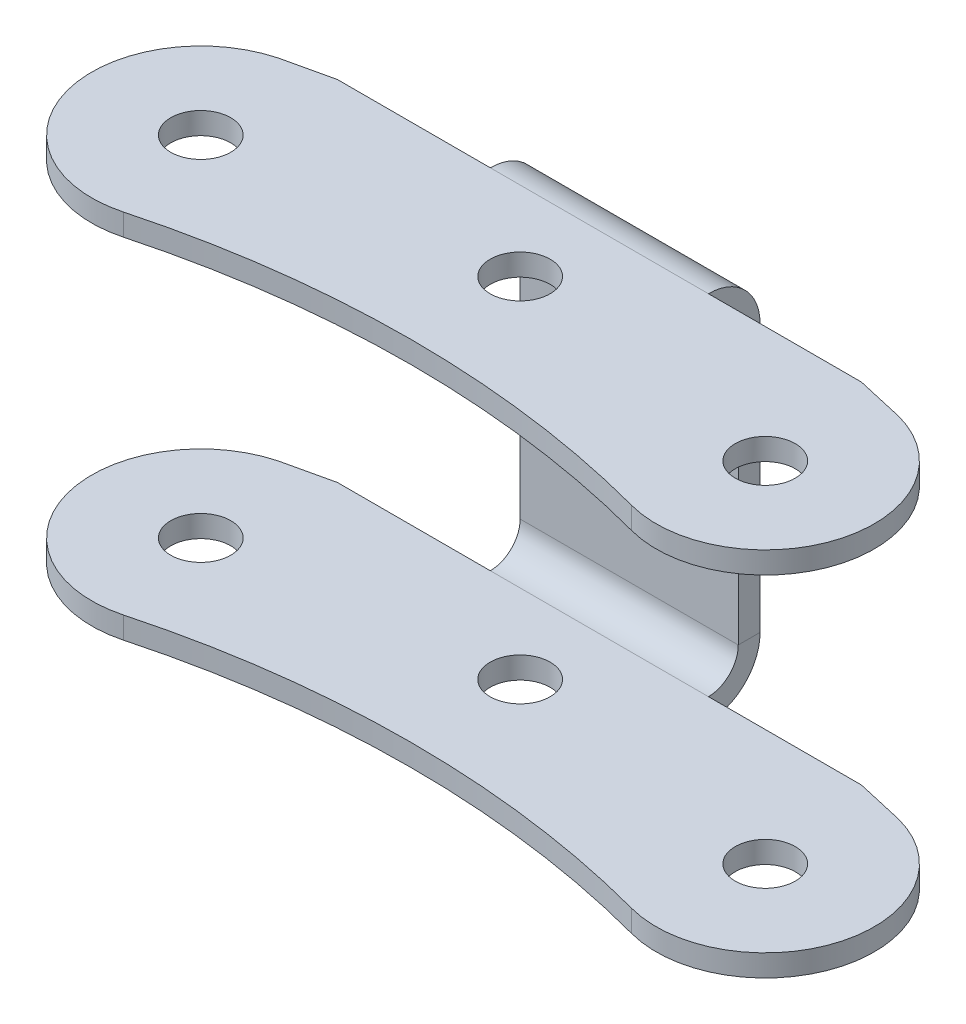
ISO-10303-21;
HEADER;
FILE_DESCRIPTION(('STEP AP214'),'2;1');
FILE_NAME('part.step','',(''),(''),'','','');
FILE_SCHEMA(('AUTOMOTIVE_DESIGN { 1 0 10303 214 1 1 1 1 }'));
ENDSEC;
DATA;
#1=APPLICATION_CONTEXT('core data for automotive mechanical design processes');
#2=APPLICATION_PROTOCOL_DEFINITION('international standard','automotive_design',2000,#1);
#3=PRODUCT_CONTEXT('',#1,'mechanical');
#4=PRODUCT('Part','Part','',(#3));
#5=PRODUCT_RELATED_PRODUCT_CATEGORY('part','',(#4));
#6=PRODUCT_DEFINITION_FORMATION('','',#4);
#7=PRODUCT_DEFINITION_CONTEXT('part definition',#1,'design');
#8=PRODUCT_DEFINITION('design','',#6,#7);
#9=PRODUCT_DEFINITION_SHAPE('','',#8);
#10=(LENGTH_UNIT() NAMED_UNIT(*) SI_UNIT(.MILLI.,.METRE.));
#11=(NAMED_UNIT(*) PLANE_ANGLE_UNIT() SI_UNIT($,.RADIAN.));
#12=(NAMED_UNIT(*) SI_UNIT($,.STERADIAN.) SOLID_ANGLE_UNIT());
#13=UNCERTAINTY_MEASURE_WITH_UNIT(LENGTH_MEASURE(1.E-05),#10,'distance_accuracy_value','');
#14=(GEOMETRIC_REPRESENTATION_CONTEXT(3) GLOBAL_UNCERTAINTY_ASSIGNED_CONTEXT((#13)) GLOBAL_UNIT_ASSIGNED_CONTEXT((#10,
#11,#12)) REPRESENTATION_CONTEXT('',''));
#15=CARTESIAN_POINT('',(0.,0.,0.));
#16=DIRECTION('',(0.,0.,1.));
#17=DIRECTION('',(1.,0.,0.));
#18=AXIS2_PLACEMENT_3D('',#15,#16,#17);
#19=CARTESIAN_POINT('',(0.,0.,-2.));
#20=DIRECTION('',(0.,0.,1.));
#21=DIRECTION('',(1.,0.,0.));
#22=AXIS2_PLACEMENT_3D('',#19,#20,#21);
#23=PLANE('',#22);
#24=DIRECTION('',(1.,0.,0.));
#25=VECTOR('',#24,1.);
#26=CARTESIAN_POINT('',(10.,-12.2634,-2.));
#27=LINE('',#26,#25);
#28=CARTESIAN_POINT('',(10.,-12.2634,-2.));
#29=VERTEX_POINT('',#28);
#30=CARTESIAN_POINT('',(-10.,-12.2634,-2.));
#31=VERTEX_POINT('',#30);
#32=EDGE_CURVE('E270',#29,#31,#27,.F.);
#33=ORIENTED_EDGE('',*,*,#32,.T.);
#34=DIRECTION('',(0.,-1.,0.));
#35=VECTOR('',#34,1.);
#36=CARTESIAN_POINT('',(-10.,17.,-2.));
#37=LINE('',#36,#35);
#38=CARTESIAN_POINT('',(-10.,12.2634,-1.99999999999999));
#39=VERTEX_POINT('',#38);
#40=EDGE_CURVE('E13',#39,#31,#37,.T.);
#41=ORIENTED_EDGE('',*,*,#40,.F.);
#42=DIRECTION('',(-1.,0.,0.));
#43=VECTOR('',#42,1.);
#44=CARTESIAN_POINT('',(-10.,12.2634,-1.99999999999999));
#45=LINE('',#44,#43);
#46=CARTESIAN_POINT('',(10.,12.2634,-2.));
#47=VERTEX_POINT('',#46);
#48=EDGE_CURVE('E351',#39,#47,#45,.F.);
#49=ORIENTED_EDGE('',*,*,#48,.T.);
#50=DIRECTION('',(0.,1.,0.));
#51=VECTOR('',#50,1.);
#52=CARTESIAN_POINT('',(10.,17.,-2.));
#53=LINE('',#52,#51);
#54=EDGE_CURVE('E98',#29,#47,#53,.T.);
#55=ORIENTED_EDGE('',*,*,#54,.F.);
#56=EDGE_LOOP('',(#33,#41,#49,#55));
#57=FACE_BOUND('',#56,.T.);
#58=ADVANCED_FACE('F89',(#57),#23,.F.);
#59=CARTESIAN_POINT('',(0.,0.,0.));
#60=DIRECTION('',(0.,0.,1.));
#61=DIRECTION('',(1.,0.,0.));
#62=AXIS2_PLACEMENT_3D('',#59,#60,#61);
#63=PLANE('',#62);
#64=DIRECTION('',(0.,-1.,0.));
#65=VECTOR('',#64,1.);
#66=CARTESIAN_POINT('',(-10.,17.,0.));
#67=LINE('',#66,#65);
#68=CARTESIAN_POINT('',(-10.,12.2634,0.));
#69=VERTEX_POINT('',#68);
#70=CARTESIAN_POINT('',(-10.,-12.2634,0.));
#71=VERTEX_POINT('',#70);
#72=EDGE_CURVE('E381',#69,#71,#67,.T.);
#73=ORIENTED_EDGE('',*,*,#72,.T.);
#74=DIRECTION('',(1.,0.,0.));
#75=VECTOR('',#74,1.);
#76=CARTESIAN_POINT('',(10.,-12.2634,0.));
#77=LINE('',#76,#75);
#78=CARTESIAN_POINT('',(10.,-12.2634,0.));
#79=VERTEX_POINT('',#78);
#80=EDGE_CURVE('E284',#79,#71,#77,.F.);
#81=ORIENTED_EDGE('',*,*,#80,.F.);
#82=DIRECTION('',(0.,1.,0.));
#83=VECTOR('',#82,1.);
#84=CARTESIAN_POINT('',(10.,17.,0.));
#85=LINE('',#84,#83);
#86=CARTESIAN_POINT('',(10.,12.2634,0.));
#87=VERTEX_POINT('',#86);
#88=EDGE_CURVE('E378',#79,#87,#85,.T.);
#89=ORIENTED_EDGE('',*,*,#88,.T.);
#90=DIRECTION('',(-1.,0.,0.));
#91=VECTOR('',#90,1.);
#92=CARTESIAN_POINT('',(-10.,12.2634,0.));
#93=LINE('',#92,#91);
#94=EDGE_CURVE('E106',#69,#87,#93,.F.);
#95=ORIENTED_EDGE('',*,*,#94,.F.);
#96=EDGE_LOOP('',(#73,#81,#89,#95));
#97=FACE_BOUND('',#96,.T.);
#98=ADVANCED_FACE('F477',(#97),#63,.T.);
#99=CARTESIAN_POINT('',(10.,17.,-2.));
#100=DIRECTION('',(1.,0.,0.));
#101=DIRECTION('',(0.,1.,0.));
#102=AXIS2_PLACEMENT_3D('',#99,#100,#101);
#103=PLANE('',#102);
#104=ORIENTED_EDGE('',*,*,#88,.F.);
#105=DIRECTION('',(0.,0.,-1.));
#106=VECTOR('',#105,1.);
#107=CARTESIAN_POINT('',(10.,-12.2634,0.));
#108=LINE('',#107,#106);
#109=EDGE_CURVE('E275',#79,#29,#108,.T.);
#110=ORIENTED_EDGE('',*,*,#109,.T.);
#111=ORIENTED_EDGE('',*,*,#54,.T.);
#112=DIRECTION('',(0.,0.,-1.));
#113=VECTOR('',#112,1.);
#114=CARTESIAN_POINT('',(10.,12.2634,0.));
#115=LINE('',#114,#113);
#116=EDGE_CURVE('E370',#87,#47,#115,.T.);
#117=ORIENTED_EDGE('',*,*,#116,.F.);
#118=EDGE_LOOP('',(#104,#110,#111,#117));
#119=FACE_BOUND('',#118,.T.);
#120=ADVANCED_FACE('F91',(#119),#103,.T.);
#121=CARTESIAN_POINT('',(-10.,17.,-2.));
#122=DIRECTION('',(-1.,0.,0.));
#123=DIRECTION('',(0.,-1.,0.));
#124=AXIS2_PLACEMENT_3D('',#121,#122,#123);
#125=PLANE('',#124);
#126=DIRECTION('',(0.,0.,-1.));
#127=VECTOR('',#126,1.);
#128=CARTESIAN_POINT('',(-10.,-12.2634,0.));
#129=LINE('',#128,#127);
#130=EDGE_CURVE('E292',#71,#31,#129,.T.);
#131=ORIENTED_EDGE('',*,*,#130,.F.);
#132=ORIENTED_EDGE('',*,*,#72,.F.);
#133=DIRECTION('',(0.,0.,-1.));
#134=VECTOR('',#133,1.);
#135=CARTESIAN_POINT('',(-10.,12.2634,0.));
#136=LINE('',#135,#134);
#137=EDGE_CURVE('E356',#69,#39,#136,.T.);
#138=ORIENTED_EDGE('',*,*,#137,.T.);
#139=ORIENTED_EDGE('',*,*,#40,.T.);
#140=EDGE_LOOP('',(#131,#132,#138,#139));
#141=FACE_BOUND('',#140,.T.);
#142=ADVANCED_FACE('F501',(#141),#125,.T.);
#143=CARTESIAN_POINT('',(10.,12.2634,2.73660000000001));
#144=DIRECTION('',(1.,0.,0.));
#145=DIRECTION('',(0.,0.,-1.));
#146=AXIS2_PLACEMENT_3D('',#143,#144,#145);
#147=PLANE('',#146);
#148=DIRECTION('',(0.,1.,0.));
#149=VECTOR('',#148,1.);
#150=CARTESIAN_POINT('',(10.,15.,2.7366));
#151=LINE('',#150,#149);
#152=CARTESIAN_POINT('',(10.,15.,2.7366));
#153=VERTEX_POINT('',#152);
#154=CARTESIAN_POINT('',(10.,17.,2.73659999999999));
#155=VERTEX_POINT('',#154);
#156=EDGE_CURVE('E373',#153,#155,#151,.T.);
#157=ORIENTED_EDGE('',*,*,#156,.F.);
#158=CARTESIAN_POINT('',(10.,12.2634,2.73660000000001));
#159=DIRECTION('',(-1.,0.,0.));
#160=DIRECTION('',(0.,0.,1.));
#161=AXIS2_PLACEMENT_3D('',#158,#159,#160);
#162=CIRCLE('',#161,2.7366);
#163=EDGE_CURVE('E360',#87,#153,#162,.F.);
#164=ORIENTED_EDGE('',*,*,#163,.F.);
#165=ORIENTED_EDGE('',*,*,#116,.T.);
#166=CARTESIAN_POINT('',(10.,12.2634,2.73660000000001));
#167=DIRECTION('',(-1.,0.,0.));
#168=DIRECTION('',(0.,0.,1.));
#169=AXIS2_PLACEMENT_3D('',#166,#167,#168);
#170=CIRCLE('',#169,4.7366);
#171=EDGE_CURVE('E353',#47,#155,#170,.F.);
#172=ORIENTED_EDGE('',*,*,#171,.T.);
#173=EDGE_LOOP('',(#157,#164,#165,#172));
#174=FACE_BOUND('',#173,.T.);
#175=ADVANCED_FACE('F503',(#174),#147,.T.);
#176=CARTESIAN_POINT('',(-10.,12.2634,2.73660000000001));
#177=DIRECTION('',(1.,0.,0.));
#178=DIRECTION('',(0.,0.,-1.));
#179=AXIS2_PLACEMENT_3D('',#176,#177,#178);
#180=PLANE('',#179);
#181=CARTESIAN_POINT('',(-10.,12.2634,2.73660000000001));
#182=DIRECTION('',(-1.,0.,0.));
#183=DIRECTION('',(0.,0.,1.));
#184=AXIS2_PLACEMENT_3D('',#181,#182,#183);
#185=CIRCLE('',#184,2.7366);
#186=CARTESIAN_POINT('',(-10.,15.,2.7366));
#187=VERTEX_POINT('',#186);
#188=EDGE_CURVE('E366',#187,#69,#185,.T.);
#189=ORIENTED_EDGE('',*,*,#188,.F.);
#190=DIRECTION('',(0.,1.,0.));
#191=VECTOR('',#190,1.);
#192=CARTESIAN_POINT('',(-10.,15.,2.7366));
#193=LINE('',#192,#191);
#194=CARTESIAN_POINT('',(-10.,17.,2.73659999999999));
#195=VERTEX_POINT('',#194);
#196=EDGE_CURVE('E376',#187,#195,#193,.T.);
#197=ORIENTED_EDGE('',*,*,#196,.T.);
#198=CARTESIAN_POINT('',(-10.,12.2634,2.73660000000001));
#199=DIRECTION('',(-1.,0.,0.));
#200=DIRECTION('',(0.,0.,1.));
#201=AXIS2_PLACEMENT_3D('',#198,#199,#200);
#202=CIRCLE('',#201,4.7366);
#203=EDGE_CURVE('E354',#195,#39,#202,.T.);
#204=ORIENTED_EDGE('',*,*,#203,.T.);
#205=ORIENTED_EDGE('',*,*,#137,.F.);
#206=EDGE_LOOP('',(#189,#197,#204,#205));
#207=FACE_BOUND('',#206,.T.);
#208=ADVANCED_FACE('F499',(#207),#180,.F.);
#209=CARTESIAN_POINT('',(-10.,12.2634,2.73660000000001));
#210=DIRECTION('',(-1.,0.,0.));
#211=DIRECTION('',(0.,1.,0.));
#212=AXIS2_PLACEMENT_3D('',#209,#210,#211);
#213=CYLINDRICAL_SURFACE('',#212,4.7366);
#214=ORIENTED_EDGE('',*,*,#48,.F.);
#215=ORIENTED_EDGE('',*,*,#203,.F.);
#216=DIRECTION('',(-1.,0.,0.));
#217=VECTOR('',#216,1.);
#218=CARTESIAN_POINT('',(-10.,17.,2.73659999999999));
#219=LINE('',#218,#217);
#220=EDGE_CURVE('E357',#155,#195,#219,.T.);
#221=ORIENTED_EDGE('',*,*,#220,.F.);
#222=ORIENTED_EDGE('',*,*,#171,.F.);
#223=EDGE_LOOP('',(#214,#215,#221,#222));
#224=FACE_BOUND('',#223,.T.);
#225=ADVANCED_FACE('F517',(#224),#213,.T.);
#226=CARTESIAN_POINT('',(-10.,12.2634,2.73660000000001));
#227=DIRECTION('',(-1.,0.,0.));
#228=DIRECTION('',(0.,1.,0.));
#229=AXIS2_PLACEMENT_3D('',#226,#227,#228);
#230=CYLINDRICAL_SURFACE('',#229,2.7366);
#231=ORIENTED_EDGE('',*,*,#94,.T.);
#232=ORIENTED_EDGE('',*,*,#163,.T.);
#233=DIRECTION('',(-1.,0.,0.));
#234=VECTOR('',#233,1.);
#235=CARTESIAN_POINT('',(-10.,15.,2.7366));
#236=LINE('',#235,#234);
#237=EDGE_CURVE('E303',#153,#187,#236,.T.);
#238=ORIENTED_EDGE('',*,*,#237,.T.);
#239=ORIENTED_EDGE('',*,*,#188,.T.);
#240=EDGE_LOOP('',(#231,#232,#238,#239));
#241=FACE_BOUND('',#240,.T.);
#242=ADVANCED_FACE('F541',(#241),#230,.F.);
#243=CARTESIAN_POINT('',(24.0251196840593,15.,2.7366));
#244=DIRECTION('',(0.,0.,-1.));
#245=DIRECTION('',(0.,1.,0.));
#246=AXIS2_PLACEMENT_3D('',#243,#244,#245);
#247=PLANE('',#246);
#248=ORIENTED_EDGE('',*,*,#196,.F.);
#249=DIRECTION('',(-1.,0.,0.));
#250=VECTOR('',#249,1.);
#251=CARTESIAN_POINT('',(24.0251196840593,15.,2.7366));
#252=LINE('',#251,#250);
#253=CARTESIAN_POINT('',(-24.0251196840594,15.,2.7366));
#254=VERTEX_POINT('',#253);
#255=EDGE_CURVE('E348',#187,#254,#252,.T.);
#256=ORIENTED_EDGE('',*,*,#255,.T.);
#257=DIRECTION('',(0.,1.,0.));
#258=VECTOR('',#257,1.);
#259=CARTESIAN_POINT('',(-24.0251196840594,15.,2.7366));
#260=LINE('',#259,#258);
#261=CARTESIAN_POINT('',(-24.0251196840593,17.,2.73659999999998));
#262=VERTEX_POINT('',#261);
#263=EDGE_CURVE('E343',#254,#262,#260,.T.);
#264=ORIENTED_EDGE('',*,*,#263,.T.);
#265=DIRECTION('',(-1.,0.,0.));
#266=VECTOR('',#265,1.);
#267=CARTESIAN_POINT('',(24.0251196840593,17.,2.7366));
#268=LINE('',#267,#266);
#269=EDGE_CURVE('E339',#262,#195,#268,.F.);
#270=ORIENTED_EDGE('',*,*,#269,.T.);
#271=EDGE_LOOP('',(#248,#256,#264,#270));
#272=FACE_BOUND('',#271,.T.);
#273=ADVANCED_FACE('F545',(#272),#247,.T.);
#274=CARTESIAN_POINT('',(12.,17.,0.));
#275=DIRECTION('',(0.221900074287889,0.,-0.975069411391327));
#276=DIRECTION('',(-0.975069411391327,0.,-0.221900074287889));
#277=AXIS2_PLACEMENT_3D('',#274,#275,#276);
#278=PLANE('',#277);
#279=DIRECTION('',(0.975069411391327,0.,0.221900074287889));
#280=VECTOR('',#279,1.);
#281=CARTESIAN_POINT('',(28.099300232636,15.,3.66377601006624));
#282=LINE('',#281,#280);
#283=CARTESIAN_POINT('',(24.0251196840593,15.,2.7366));
#284=VERTEX_POINT('',#283);
#285=CARTESIAN_POINT('',(28.4700949612768,15.,3.74815910820237));
#286=VERTEX_POINT('',#285);
#287=EDGE_CURVE('E337',#284,#286,#282,.T.);
#288=ORIENTED_EDGE('',*,*,#287,.F.);
#289=DIRECTION('',(0.,1.,0.));
#290=VECTOR('',#289,1.);
#291=CARTESIAN_POINT('',(24.0251196840593,17.,2.7366));
#292=LINE('',#291,#290);
#293=CARTESIAN_POINT('',(24.0251196840593,17.,2.7366));
#294=VERTEX_POINT('',#293);
#295=EDGE_CURVE('E299',#284,#294,#292,.T.);
#296=ORIENTED_EDGE('',*,*,#295,.T.);
#297=DIRECTION('',(-0.975069411391327,0.,-0.221900074287889));
#298=VECTOR('',#297,1.);
#299=CARTESIAN_POINT('',(12.,17.,0.));
#300=LINE('',#299,#298);
#301=CARTESIAN_POINT('',(28.4700949612768,17.,3.74815910820237));
#302=VERTEX_POINT('',#301);
#303=EDGE_CURVE('E323',#294,#302,#300,.F.);
#304=ORIENTED_EDGE('',*,*,#303,.T.);
#305=DIRECTION('',(0.,-1.,0.));
#306=VECTOR('',#305,1.);
#307=CARTESIAN_POINT('',(28.4700949612774,17.,3.74815910820252));
#308=LINE('',#307,#306);
#309=EDGE_CURVE('E308',#302,#286,#308,.T.);
#310=ORIENTED_EDGE('',*,*,#309,.T.);
#311=EDGE_LOOP('',(#288,#296,#304,#310));
#312=FACE_BOUND('',#311,.T.);
#313=ADVANCED_FACE('F530',(#312),#278,.T.);
#314=CARTESIAN_POINT('',(-12.,17.,0.));
#315=DIRECTION('',(-0.221900074287887,0.,-0.975069411391328));
#316=DIRECTION('',(-0.975069411391328,0.,0.221900074287887));
#317=AXIS2_PLACEMENT_3D('',#314,#315,#316);
#318=PLANE('',#317);
#319=DIRECTION('',(-0.975069411391328,0.,0.221900074287887));
#320=VECTOR('',#319,1.);
#321=CARTESIAN_POINT('',(-12.,17.,0.));
#322=LINE('',#321,#320);
#323=CARTESIAN_POINT('',(-28.470094961276,17.,3.74815910820212));
#324=VERTEX_POINT('',#323);
#325=EDGE_CURVE('E311',#324,#262,#322,.F.);
#326=ORIENTED_EDGE('',*,*,#325,.T.);
#327=ORIENTED_EDGE('',*,*,#263,.F.);
#328=DIRECTION('',(0.975069411391328,0.,-0.221900074287887));
#329=VECTOR('',#328,1.);
#330=CARTESIAN_POINT('',(21.1156773129848,15.,-7.53625451685498));
#331=LINE('',#330,#329);
#332=CARTESIAN_POINT('',(-28.4700949612759,15.,3.74815910820212));
#333=VERTEX_POINT('',#332);
#334=EDGE_CURVE('E325',#333,#254,#331,.T.);
#335=ORIENTED_EDGE('',*,*,#334,.F.);
#336=DIRECTION('',(0.,-1.,0.));
#337=VECTOR('',#336,1.);
#338=CARTESIAN_POINT('',(-28.4700949612766,17.,3.74815910820226));
#339=LINE('',#338,#337);
#340=EDGE_CURVE('E301',#324,#333,#339,.T.);
#341=ORIENTED_EDGE('',*,*,#340,.F.);
#342=EDGE_LOOP('',(#326,#327,#335,#341));
#343=FACE_BOUND('',#342,.T.);
#344=ADVANCED_FACE('F550',(#343),#318,.T.);
#345=CARTESIAN_POINT('',(25.8819045102522,17.,13.4074173710932));
#346=DIRECTION('',(0.,-1.,0.));
#347=DIRECTION('',(0.,0.,-1.));
#348=AXIS2_PLACEMENT_3D('',#345,#346,#347);
#349=PLANE('',#348);
#350=CARTESIAN_POINT('',(0.,17.,9.99999999999994));
#351=DIRECTION('',(0.,1.,0.));
#352=DIRECTION('',(0.,0.,1.));
#353=AXIS2_PLACEMENT_3D('',#350,#351,#352);
#354=CIRCLE('',#353,2.75);
#355=CARTESIAN_POINT('',(0.,17.,12.7499999999999));
#356=VERTEX_POINT('',#355);
#357=EDGE_CURVE('E397',#356,#356,#354,.T.);
#358=ORIENTED_EDGE('',*,*,#357,.F.);
#359=EDGE_LOOP('',(#358));
#360=FACE_BOUND('',#359,.T.);
#361=CARTESIAN_POINT('',(-25.8819045102514,17.,13.407417371093));
#362=DIRECTION('',(0.,1.,0.));
#363=DIRECTION('',(0.,0.,1.));
#364=AXIS2_PLACEMENT_3D('',#361,#362,#363);
#365=CIRCLE('',#364,2.75);
#366=CARTESIAN_POINT('',(-25.8819045102514,17.0000000000001,16.157417371093));
#367=VERTEX_POINT('',#366);
#368=EDGE_CURVE('E407',#367,#367,#365,.T.);
#369=ORIENTED_EDGE('',*,*,#368,.F.);
#370=EDGE_LOOP('',(#369));
#371=FACE_BOUND('',#370,.T.);
#372=CARTESIAN_POINT('',(25.8819045102514,17.,13.4074173710929));
#373=DIRECTION('',(0.,1.,0.));
#374=DIRECTION('',(0.,0.,1.));
#375=AXIS2_PLACEMENT_3D('',#372,#373,#374);
#376=CIRCLE('',#375,2.75);
#377=CARTESIAN_POINT('',(25.8819045102514,17.0000000000001,16.1574173710929));
#378=VERTEX_POINT('',#377);
#379=EDGE_CURVE('E413',#378,#378,#376,.T.);
#380=ORIENTED_EDGE('',*,*,#379,.F.);
#381=EDGE_LOOP('',(#380));
#382=FACE_BOUND('',#381,.T.);
#383=ORIENTED_EDGE('',*,*,#269,.F.);
#384=ORIENTED_EDGE('',*,*,#325,.F.);
#385=CARTESIAN_POINT('',(-25.8819045102514,17.,13.407417371093));
#386=DIRECTION('',(0.,-1.,0.));
#387=DIRECTION('',(0.,0.,-1.));
#388=AXIS2_PLACEMENT_3D('',#385,#386,#387);
#389=CIRCLE('',#388,9.99999999999999);
#390=CARTESIAN_POINT('',(-23.2937140592263,17.0000000000001,23.0666756339837));
#391=VERTEX_POINT('',#390);
#392=EDGE_CURVE('E314',#391,#324,#389,.T.);
#393=ORIENTED_EDGE('',*,*,#392,.F.);
#394=CARTESIAN_POINT('',(0.,17.0000000000004,110.));
#395=DIRECTION('',(0.,-1.,0.));
#396=DIRECTION('',(0.,0.,-1.));
#397=AXIS2_PLACEMENT_3D('',#394,#395,#396);
#398=CIRCLE('',#397,90.0000000000001);
#399=CARTESIAN_POINT('',(23.293714059227,17.0000000000001,23.0666756339838));
#400=VERTEX_POINT('',#399);
#401=EDGE_CURVE('E317',#400,#391,#398,.F.);
#402=ORIENTED_EDGE('',*,*,#401,.F.);
#403=CARTESIAN_POINT('',(25.8819045102522,17.,13.4074173710932));
#404=DIRECTION('',(0.,-1.,0.));
#405=DIRECTION('',(0.,0.,-1.));
#406=AXIS2_PLACEMENT_3D('',#403,#404,#405);
#407=CIRCLE('',#406,9.99999999999999);
#408=EDGE_CURVE('E320',#302,#400,#407,.T.);
#409=ORIENTED_EDGE('',*,*,#408,.F.);
#410=ORIENTED_EDGE('',*,*,#303,.F.);
#411=EDGE_CURVE('E342',#155,#294,#268,.F.);
#412=ORIENTED_EDGE('',*,*,#411,.F.);
#413=ORIENTED_EDGE('',*,*,#220,.T.);
#414=EDGE_LOOP('',(#383,#384,#393,#402,#409,#410,#412,#413));
#415=FACE_BOUND('',#414,.T.);
#416=ADVANCED_FACE('F524',(#360,#371,#382,#415),#349,.F.);
#417=CARTESIAN_POINT('',(25.8819045102522,15.,13.4074173710932));
#418=DIRECTION('',(0.,-1.,0.));
#419=DIRECTION('',(0.,0.,-1.));
#420=AXIS2_PLACEMENT_3D('',#417,#418,#419);
#421=PLANE('',#420);
#422=CARTESIAN_POINT('',(0.,15.,9.99999999999994));
#423=DIRECTION('',(0.,-1.,0.));
#424=DIRECTION('',(0.,0.,-1.));
#425=AXIS2_PLACEMENT_3D('',#422,#423,#424);
#426=CIRCLE('',#425,2.75);
#427=CARTESIAN_POINT('',(0.,15.,7.24999999999994));
#428=VERTEX_POINT('',#427);
#429=EDGE_CURVE('E410',#428,#428,#426,.T.);
#430=ORIENTED_EDGE('',*,*,#429,.F.);
#431=EDGE_LOOP('',(#430));
#432=FACE_BOUND('',#431,.T.);
#433=CARTESIAN_POINT('',(-25.8819045102514,15.,13.407417371093));
#434=DIRECTION('',(0.,-1.,0.));
#435=DIRECTION('',(0.,0.,-1.));
#436=AXIS2_PLACEMENT_3D('',#433,#434,#435);
#437=CIRCLE('',#436,2.75);
#438=CARTESIAN_POINT('',(-25.8819045102514,15.,10.657417371093));
#439=VERTEX_POINT('',#438);
#440=EDGE_CURVE('E390',#439,#439,#437,.T.);
#441=ORIENTED_EDGE('',*,*,#440,.F.);
#442=EDGE_LOOP('',(#441));
#443=FACE_BOUND('',#442,.T.);
#444=CARTESIAN_POINT('',(25.8819045102514,15.,13.4074173710929));
#445=DIRECTION('',(0.,-1.,0.));
#446=DIRECTION('',(0.,0.,-1.));
#447=AXIS2_PLACEMENT_3D('',#444,#445,#446);
#448=CIRCLE('',#447,2.75);
#449=CARTESIAN_POINT('',(25.8819045102514,15.,10.6574173710929));
#450=VERTEX_POINT('',#449);
#451=EDGE_CURVE('E241',#450,#450,#448,.T.);
#452=ORIENTED_EDGE('',*,*,#451,.F.);
#453=EDGE_LOOP('',(#452));
#454=FACE_BOUND('',#453,.T.);
#455=ORIENTED_EDGE('',*,*,#334,.T.);
#456=ORIENTED_EDGE('',*,*,#255,.F.);
#457=ORIENTED_EDGE('',*,*,#237,.F.);
#458=EDGE_CURVE('E345',#284,#153,#252,.T.);
#459=ORIENTED_EDGE('',*,*,#458,.F.);
#460=ORIENTED_EDGE('',*,*,#287,.T.);
#461=CARTESIAN_POINT('',(25.8819045102522,15.,13.4074173710932));
#462=DIRECTION('',(0.,-1.,0.));
#463=DIRECTION('',(0.,0.,-1.));
#464=AXIS2_PLACEMENT_3D('',#461,#462,#463);
#465=CIRCLE('',#464,9.99999999999999);
#466=CARTESIAN_POINT('',(23.293714059227,15.0000000000001,23.0666756339838));
#467=VERTEX_POINT('',#466);
#468=EDGE_CURVE('E334',#286,#467,#465,.T.);
#469=ORIENTED_EDGE('',*,*,#468,.T.);
#470=CARTESIAN_POINT('',(0.,15.0000000000004,110.));
#471=DIRECTION('',(0.,-1.,0.));
#472=DIRECTION('',(0.,0.,-1.));
#473=AXIS2_PLACEMENT_3D('',#470,#471,#472);
#474=CIRCLE('',#473,90.0000000000001);
#475=CARTESIAN_POINT('',(-23.2937140592263,15.0000000000001,23.0666756339837));
#476=VERTEX_POINT('',#475);
#477=EDGE_CURVE('E331',#467,#476,#474,.F.);
#478=ORIENTED_EDGE('',*,*,#477,.T.);
#479=CARTESIAN_POINT('',(-25.8819045102514,15.,13.407417371093));
#480=DIRECTION('',(0.,-1.,0.));
#481=DIRECTION('',(0.,0.,-1.));
#482=AXIS2_PLACEMENT_3D('',#479,#480,#481);
#483=CIRCLE('',#482,9.99999999999999);
#484=EDGE_CURVE('E328',#476,#333,#483,.T.);
#485=ORIENTED_EDGE('',*,*,#484,.T.);
#486=EDGE_LOOP('',(#455,#456,#457,#459,#460,#469,#478,#485));
#487=FACE_BOUND('',#486,.T.);
#488=ADVANCED_FACE('F536',(#432,#443,#454,#487),#421,.T.);
#489=CARTESIAN_POINT('',(-25.8819045102514,17.,13.407417371093));
#490=DIRECTION('',(0.,-1.,0.));
#491=DIRECTION('',(0.,0.,-1.));
#492=AXIS2_PLACEMENT_3D('',#489,#490,#491);
#493=CYLINDRICAL_SURFACE('',#492,9.99999999999999);
#494=ORIENTED_EDGE('',*,*,#484,.F.);
#495=DIRECTION('',(0.,-1.,0.));
#496=VECTOR('',#495,1.);
#497=CARTESIAN_POINT('',(-23.2937140592263,17.0000000000001,23.0666756339837));
#498=LINE('',#497,#496);
#499=EDGE_CURVE('E304',#391,#476,#498,.T.);
#500=ORIENTED_EDGE('',*,*,#499,.F.);
#501=ORIENTED_EDGE('',*,*,#392,.T.);
#502=ORIENTED_EDGE('',*,*,#340,.T.);
#503=EDGE_LOOP('',(#494,#500,#501,#502));
#504=FACE_BOUND('',#503,.T.);
#505=ADVANCED_FACE('F554',(#504),#493,.T.);
#506=CARTESIAN_POINT('',(0.,17.0000000000004,110.));
#507=DIRECTION('',(0.,-1.,0.));
#508=DIRECTION('',(0.,0.,-1.));
#509=AXIS2_PLACEMENT_3D('',#506,#507,#508);
#510=CYLINDRICAL_SURFACE('',#509,90.0000000000001);
#511=ORIENTED_EDGE('',*,*,#477,.F.);
#512=DIRECTION('',(0.,-1.,0.));
#513=VECTOR('',#512,1.);
#514=CARTESIAN_POINT('',(23.293714059227,17.0000000000001,23.0666756339838));
#515=LINE('',#514,#513);
#516=EDGE_CURVE('E306',#400,#467,#515,.T.);
#517=ORIENTED_EDGE('',*,*,#516,.F.);
#518=ORIENTED_EDGE('',*,*,#401,.T.);
#519=ORIENTED_EDGE('',*,*,#499,.T.);
#520=EDGE_LOOP('',(#511,#517,#518,#519));
#521=FACE_BOUND('',#520,.T.);
#522=ADVANCED_FACE('F556',(#521),#510,.F.);
#523=CARTESIAN_POINT('',(25.8819045102522,17.,13.4074173710932));
#524=DIRECTION('',(0.,-1.,0.));
#525=DIRECTION('',(0.,0.,-1.));
#526=AXIS2_PLACEMENT_3D('',#523,#524,#525);
#527=CYLINDRICAL_SURFACE('',#526,9.99999999999999);
#528=ORIENTED_EDGE('',*,*,#468,.F.);
#529=ORIENTED_EDGE('',*,*,#309,.F.);
#530=ORIENTED_EDGE('',*,*,#408,.T.);
#531=ORIENTED_EDGE('',*,*,#516,.T.);
#532=EDGE_LOOP('',(#528,#529,#530,#531));
#533=FACE_BOUND('',#532,.T.);
#534=ADVANCED_FACE('F533',(#533),#527,.T.);
#535=ORIENTED_EDGE('',*,*,#458,.T.);
#536=ORIENTED_EDGE('',*,*,#156,.T.);
#537=ORIENTED_EDGE('',*,*,#411,.T.);
#538=ORIENTED_EDGE('',*,*,#295,.F.);
#539=EDGE_LOOP('',(#535,#536,#537,#538));
#540=FACE_BOUND('',#539,.T.);
#541=ADVANCED_FACE('F488',(#540),#247,.T.);
#542=CARTESIAN_POINT('',(-10.,-12.2634,2.73659999999999));
#543=DIRECTION('',(-1.,0.,0.));
#544=DIRECTION('',(0.,0.,1.));
#545=AXIS2_PLACEMENT_3D('',#542,#543,#544);
#546=PLANE('',#545);
#547=DIRECTION('',(0.,-1.,0.));
#548=VECTOR('',#547,1.);
#549=CARTESIAN_POINT('',(-10.,-15.,2.73659999999998));
#550=LINE('',#549,#548);
#551=CARTESIAN_POINT('',(-10.,-15.,2.73659999999998));
#552=VERTEX_POINT('',#551);
#553=CARTESIAN_POINT('',(-10.,-17.,2.73659999999998));
#554=VERTEX_POINT('',#553);
#555=EDGE_CURVE('E295',#552,#554,#550,.T.);
#556=ORIENTED_EDGE('',*,*,#555,.F.);
#557=CARTESIAN_POINT('',(-10.,-12.2634,2.73659999999999));
#558=DIRECTION('',(1.,0.,0.));
#559=DIRECTION('',(0.,0.,-1.));
#560=AXIS2_PLACEMENT_3D('',#557,#558,#559);
#561=CIRCLE('',#560,2.7366);
#562=EDGE_CURVE('E279',#71,#552,#561,.F.);
#563=ORIENTED_EDGE('',*,*,#562,.F.);
#564=ORIENTED_EDGE('',*,*,#130,.T.);
#565=CARTESIAN_POINT('',(-10.,-12.2634,2.73659999999999));
#566=DIRECTION('',(1.,0.,0.));
#567=DIRECTION('',(0.,0.,-1.));
#568=AXIS2_PLACEMENT_3D('',#565,#566,#567);
#569=CIRCLE('',#568,4.7366);
#570=EDGE_CURVE('E272',#31,#554,#569,.F.);
#571=ORIENTED_EDGE('',*,*,#570,.T.);
#572=EDGE_LOOP('',(#556,#563,#564,#571));
#573=FACE_BOUND('',#572,.T.);
#574=ADVANCED_FACE('F472',(#573),#546,.T.);
#575=CARTESIAN_POINT('',(10.,-12.2634,2.7366));
#576=DIRECTION('',(-1.,0.,0.));
#577=DIRECTION('',(0.,0.,1.));
#578=AXIS2_PLACEMENT_3D('',#575,#576,#577);
#579=PLANE('',#578);
#580=CARTESIAN_POINT('',(10.,-12.2634,2.7366));
#581=DIRECTION('',(1.,0.,0.));
#582=DIRECTION('',(0.,0.,-1.));
#583=AXIS2_PLACEMENT_3D('',#580,#581,#582);
#584=CIRCLE('',#583,2.7366);
#585=CARTESIAN_POINT('',(10.,-15.,2.73659999999999));
#586=VERTEX_POINT('',#585);
#587=EDGE_CURVE('E287',#586,#79,#584,.T.);
#588=ORIENTED_EDGE('',*,*,#587,.F.);
#589=DIRECTION('',(0.,-1.,0.));
#590=VECTOR('',#589,1.);
#591=CARTESIAN_POINT('',(10.,-15.,2.73659999999999));
#592=LINE('',#591,#590);
#593=CARTESIAN_POINT('',(10.,-17.,2.73659999999998));
#594=VERTEX_POINT('',#593);
#595=EDGE_CURVE('E297',#586,#594,#592,.T.);
#596=ORIENTED_EDGE('',*,*,#595,.T.);
#597=CARTESIAN_POINT('',(10.,-12.2634,2.7366));
#598=DIRECTION('',(1.,0.,0.));
#599=DIRECTION('',(0.,0.,-1.));
#600=AXIS2_PLACEMENT_3D('',#597,#598,#599);
#601=CIRCLE('',#600,4.7366);
#602=EDGE_CURVE('E273',#594,#29,#601,.T.);
#603=ORIENTED_EDGE('',*,*,#602,.T.);
#604=ORIENTED_EDGE('',*,*,#109,.F.);
#605=EDGE_LOOP('',(#588,#596,#603,#604));
#606=FACE_BOUND('',#605,.T.);
#607=ADVANCED_FACE('F480',(#606),#579,.F.);
#608=CARTESIAN_POINT('',(10.,-12.2634,2.7366));
#609=DIRECTION('',(1.,0.,0.));
#610=DIRECTION('',(0.,-1.,0.));
#611=AXIS2_PLACEMENT_3D('',#608,#609,#610);
#612=CYLINDRICAL_SURFACE('',#611,4.7366);
#613=ORIENTED_EDGE('',*,*,#32,.F.);
#614=ORIENTED_EDGE('',*,*,#602,.F.);
#615=DIRECTION('',(1.,0.,0.));
#616=VECTOR('',#615,1.);
#617=CARTESIAN_POINT('',(10.,-17.,2.73659999999998));
#618=LINE('',#617,#616);
#619=EDGE_CURVE('E276',#554,#594,#618,.T.);
#620=ORIENTED_EDGE('',*,*,#619,.F.);
#621=ORIENTED_EDGE('',*,*,#570,.F.);
#622=EDGE_LOOP('',(#613,#614,#620,#621));
#623=FACE_BOUND('',#622,.T.);
#624=ADVANCED_FACE('F469',(#623),#612,.T.);
#625=CARTESIAN_POINT('',(10.,-12.2634,2.7366));
#626=DIRECTION('',(1.,0.,0.));
#627=DIRECTION('',(0.,-1.,0.));
#628=AXIS2_PLACEMENT_3D('',#625,#626,#627);
#629=CYLINDRICAL_SURFACE('',#628,2.7366);
#630=ORIENTED_EDGE('',*,*,#80,.T.);
#631=ORIENTED_EDGE('',*,*,#562,.T.);
#632=DIRECTION('',(1.,0.,0.));
#633=VECTOR('',#632,1.);
#634=CARTESIAN_POINT('',(10.,-15.,2.73659999999999));
#635=LINE('',#634,#633);
#636=EDGE_CURVE('E251',#552,#586,#635,.T.);
#637=ORIENTED_EDGE('',*,*,#636,.T.);
#638=ORIENTED_EDGE('',*,*,#587,.T.);
#639=EDGE_LOOP('',(#630,#631,#637,#638));
#640=FACE_BOUND('',#639,.T.);
#641=ADVANCED_FACE('F474',(#640),#629,.F.);
#642=CARTESIAN_POINT('',(-24.0251196840593,-15.,2.73659999999998));
#643=DIRECTION('',(0.,0.,-1.));
#644=DIRECTION('',(0.,1.,0.));
#645=AXIS2_PLACEMENT_3D('',#642,#643,#644);
#646=PLANE('',#645);
#647=ORIENTED_EDGE('',*,*,#595,.F.);
#648=DIRECTION('',(1.,0.,0.));
#649=VECTOR('',#648,1.);
#650=CARTESIAN_POINT('',(-24.0251196840593,-15.,2.73659999999998));
#651=LINE('',#650,#649);
#652=CARTESIAN_POINT('',(24.0251196840591,-15.,2.73659999999998));
#653=VERTEX_POINT('',#652);
#654=EDGE_CURVE('E240',#586,#653,#651,.T.);
#655=ORIENTED_EDGE('',*,*,#654,.T.);
#656=DIRECTION('',(0.,1.,0.));
#657=VECTOR('',#656,1.);
#658=CARTESIAN_POINT('',(24.0251196840592,-15.,2.73659999999999));
#659=LINE('',#658,#657);
#660=CARTESIAN_POINT('',(24.0251196840591,-17.,2.73659999999997));
#661=VERTEX_POINT('',#660);
#662=EDGE_CURVE('E252',#653,#661,#659,.F.);
#663=ORIENTED_EDGE('',*,*,#662,.T.);
#664=DIRECTION('',(1.,0.,0.));
#665=VECTOR('',#664,1.);
#666=CARTESIAN_POINT('',(-24.0251196840593,-17.,2.73659999999997));
#667=LINE('',#666,#665);
#668=EDGE_CURVE('E263',#661,#594,#667,.F.);
#669=ORIENTED_EDGE('',*,*,#668,.T.);
#670=EDGE_LOOP('',(#647,#655,#663,#669));
#671=FACE_BOUND('',#670,.T.);
#672=ADVANCED_FACE('F463',(#671),#646,.T.);
#673=CARTESIAN_POINT('',(12.,-17.,0.));
#674=DIRECTION('',(-0.221900074287889,0.,0.975069411391327));
#675=DIRECTION('',(0.975069411391327,0.,0.221900074287889));
#676=AXIS2_PLACEMENT_3D('',#673,#674,#675);
#677=PLANE('',#676);
#678=ORIENTED_EDGE('',*,*,#662,.F.);
#679=DIRECTION('',(-0.975069411391327,0.,-0.221900074287889));
#680=VECTOR('',#679,1.);
#681=CARTESIAN_POINT('',(12.,-15.,0.));
#682=LINE('',#681,#680);
#683=CARTESIAN_POINT('',(28.4700949612768,-15.,3.74815910820238));
#684=VERTEX_POINT('',#683);
#685=EDGE_CURVE('E259',#653,#684,#682,.F.);
#686=ORIENTED_EDGE('',*,*,#685,.T.);
#687=DIRECTION('',(0.,1.,0.));
#688=VECTOR('',#687,1.);
#689=CARTESIAN_POINT('',(28.4700949612774,-17.,3.74815910820252));
#690=LINE('',#689,#688);
#691=CARTESIAN_POINT('',(28.4700949612768,-17.,3.74815910820236));
#692=VERTEX_POINT('',#691);
#693=EDGE_CURVE('E291',#692,#684,#690,.T.);
#694=ORIENTED_EDGE('',*,*,#693,.F.);
#695=DIRECTION('',(0.975069411391327,0.,0.221900074287889));
#696=VECTOR('',#695,1.);
#697=CARTESIAN_POINT('',(28.099300232636,-17.,3.66377601006623));
#698=LINE('',#697,#696);
#699=EDGE_CURVE('E437',#661,#692,#698,.T.);
#700=ORIENTED_EDGE('',*,*,#699,.F.);
#701=EDGE_LOOP('',(#678,#686,#694,#700));
#702=FACE_BOUND('',#701,.T.);
#703=ADVANCED_FACE('F460',(#702),#677,.F.);
#704=CARTESIAN_POINT('',(-12.,-17.,0.));
#705=DIRECTION('',(0.221900074287887,0.,0.975069411391328));
#706=DIRECTION('',(0.975069411391328,0.,-0.221900074287887));
#707=AXIS2_PLACEMENT_3D('',#704,#705,#706);
#708=PLANE('',#707);
#709=DIRECTION('',(0.,1.,0.));
#710=VECTOR('',#709,1.);
#711=CARTESIAN_POINT('',(-24.0251196840593,-17.,2.73659999999997));
#712=LINE('',#711,#710);
#713=CARTESIAN_POINT('',(-24.0251196840593,-15.,2.73659999999998));
#714=VERTEX_POINT('',#713);
#715=CARTESIAN_POINT('',(-24.0251196840594,-17.,2.73659999999999));
#716=VERTEX_POINT('',#715);
#717=EDGE_CURVE('E229',#714,#716,#712,.F.);
#718=ORIENTED_EDGE('',*,*,#717,.T.);
#719=DIRECTION('',(0.975069411391328,0.,-0.221900074287887));
#720=VECTOR('',#719,1.);
#721=CARTESIAN_POINT('',(21.1156773129848,-17.,-7.53625451685499));
#722=LINE('',#721,#720);
#723=CARTESIAN_POINT('',(-28.4700949612759,-17.,3.74815910820211));
#724=VERTEX_POINT('',#723);
#725=EDGE_CURVE('E435',#724,#716,#722,.T.);
#726=ORIENTED_EDGE('',*,*,#725,.F.);
#727=DIRECTION('',(0.,1.,0.));
#728=VECTOR('',#727,1.);
#729=CARTESIAN_POINT('',(-28.4700949612766,-17.,3.74815910820226));
#730=LINE('',#729,#728);
#731=CARTESIAN_POINT('',(-28.470094961276,-15.,3.74815910820213));
#732=VERTEX_POINT('',#731);
#733=EDGE_CURVE('E257',#724,#732,#730,.T.);
#734=ORIENTED_EDGE('',*,*,#733,.T.);
#735=DIRECTION('',(-0.975069411391328,0.,0.221900074287887));
#736=VECTOR('',#735,1.);
#737=CARTESIAN_POINT('',(-12.,-15.,0.));
#738=LINE('',#737,#736);
#739=EDGE_CURVE('E249',#732,#714,#738,.F.);
#740=ORIENTED_EDGE('',*,*,#739,.T.);
#741=EDGE_LOOP('',(#718,#726,#734,#740));
#742=FACE_BOUND('',#741,.T.);
#743=ADVANCED_FACE('F255',(#742),#708,.F.);
#744=CARTESIAN_POINT('',(25.8819045102522,-17.,13.4074173710932));
#745=DIRECTION('',(0.,1.,0.));
#746=DIRECTION('',(0.,0.,-1.));
#747=AXIS2_PLACEMENT_3D('',#744,#745,#746);
#748=PLANE('',#747);
#749=CARTESIAN_POINT('',(0.,-17.0000000000001,10.));
#750=DIRECTION('',(0.,1.,0.));
#751=DIRECTION('',(0.,0.,1.));
#752=AXIS2_PLACEMENT_3D('',#749,#750,#751);
#753=CIRCLE('',#752,2.75);
#754=CARTESIAN_POINT('',(0.,-17.0000000000001,12.75));
#755=VERTEX_POINT('',#754);
#756=EDGE_CURVE('E391',#755,#755,#753,.T.);
#757=ORIENTED_EDGE('',*,*,#756,.T.);
#758=EDGE_LOOP('',(#757));
#759=FACE_BOUND('',#758,.T.);
#760=CARTESIAN_POINT('',(-25.8819045102514,-17.0000000000001,13.4074173710931));
#761=DIRECTION('',(0.,1.,0.));
#762=DIRECTION('',(0.,0.,1.));
#763=AXIS2_PLACEMENT_3D('',#760,#761,#762);
#764=CIRCLE('',#763,2.75);
#765=CARTESIAN_POINT('',(-25.8819045102514,-17.0000000000001,16.1574173710931));
#766=VERTEX_POINT('',#765);
#767=EDGE_CURVE('E402',#766,#766,#764,.T.);
#768=ORIENTED_EDGE('',*,*,#767,.T.);
#769=EDGE_LOOP('',(#768));
#770=FACE_BOUND('',#769,.T.);
#771=CARTESIAN_POINT('',(25.8819045102514,-17.0000000000001,13.407417371093));
#772=DIRECTION('',(0.,1.,0.));
#773=DIRECTION('',(0.,0.,1.));
#774=AXIS2_PLACEMENT_3D('',#771,#772,#773);
#775=CIRCLE('',#774,2.75);
#776=CARTESIAN_POINT('',(25.8819045102514,-17.0000000000001,16.157417371093));
#777=VERTEX_POINT('',#776);
#778=EDGE_CURVE('E387',#777,#777,#775,.T.);
#779=ORIENTED_EDGE('',*,*,#778,.T.);
#780=EDGE_LOOP('',(#779));
#781=FACE_BOUND('',#780,.T.);
#782=ORIENTED_EDGE('',*,*,#668,.F.);
#783=ORIENTED_EDGE('',*,*,#699,.T.);
#784=CARTESIAN_POINT('',(25.8819045102522,-17.,13.4074173710932));
#785=DIRECTION('',(0.,1.,0.));
#786=DIRECTION('',(0.,0.,1.));
#787=AXIS2_PLACEMENT_3D('',#784,#785,#786);
#788=CIRCLE('',#787,9.99999999999999);
#789=CARTESIAN_POINT('',(23.293714059227,-17.0000000000001,23.0666756339839));
#790=VERTEX_POINT('',#789);
#791=EDGE_CURVE('E429',#692,#790,#788,.F.);
#792=ORIENTED_EDGE('',*,*,#791,.T.);
#793=CARTESIAN_POINT('',(0.,-17.0000000000004,110.));
#794=DIRECTION('',(0.,1.,0.));
#795=DIRECTION('',(0.,0.,1.));
#796=AXIS2_PLACEMENT_3D('',#793,#794,#795);
#797=CIRCLE('',#796,90.0000000000001);
#798=CARTESIAN_POINT('',(-23.2937140592263,-17.0000000000001,23.0666756339837));
#799=VERTEX_POINT('',#798);
#800=EDGE_CURVE('E431',#790,#799,#797,.T.);
#801=ORIENTED_EDGE('',*,*,#800,.T.);
#802=CARTESIAN_POINT('',(-25.8819045102514,-17.,13.407417371093));
#803=DIRECTION('',(0.,1.,0.));
#804=DIRECTION('',(0.,0.,1.));
#805=AXIS2_PLACEMENT_3D('',#802,#803,#804);
#806=CIRCLE('',#805,9.99999999999999);
#807=EDGE_CURVE('E433',#799,#724,#806,.F.);
#808=ORIENTED_EDGE('',*,*,#807,.T.);
#809=ORIENTED_EDGE('',*,*,#725,.T.);
#810=EDGE_CURVE('E235',#554,#716,#667,.F.);
#811=ORIENTED_EDGE('',*,*,#810,.F.);
#812=ORIENTED_EDGE('',*,*,#619,.T.);
#813=EDGE_LOOP('',(#782,#783,#792,#801,#808,#809,#811,#812));
#814=FACE_BOUND('',#813,.T.);
#815=ADVANCED_FACE('F452',(#759,#770,#781,#814),#748,.F.);
#816=CARTESIAN_POINT('',(25.8819045102522,-15.,13.4074173710932));
#817=DIRECTION('',(0.,1.,0.));
#818=DIRECTION('',(0.,0.,-1.));
#819=AXIS2_PLACEMENT_3D('',#816,#817,#818);
#820=PLANE('',#819);
#821=CARTESIAN_POINT('',(0.,-15.,10.));
#822=DIRECTION('',(0.,1.,0.));
#823=DIRECTION('',(0.,0.,1.));
#824=AXIS2_PLACEMENT_3D('',#821,#822,#823);
#825=CIRCLE('',#824,2.75);
#826=CARTESIAN_POINT('',(0.,-15.,12.75));
#827=VERTEX_POINT('',#826);
#828=EDGE_CURVE('E93',#827,#827,#825,.T.);
#829=ORIENTED_EDGE('',*,*,#828,.F.);
#830=EDGE_LOOP('',(#829));
#831=FACE_BOUND('',#830,.T.);
#832=CARTESIAN_POINT('',(-25.8819045102514,-15.,13.4074173710931));
#833=DIRECTION('',(0.,1.,0.));
#834=DIRECTION('',(0.,0.,1.));
#835=AXIS2_PLACEMENT_3D('',#832,#833,#834);
#836=CIRCLE('',#835,2.75);
#837=CARTESIAN_POINT('',(-25.8819045102514,-15.0000000000001,16.1574173710931));
#838=VERTEX_POINT('',#837);
#839=EDGE_CURVE('E388',#838,#838,#836,.T.);
#840=ORIENTED_EDGE('',*,*,#839,.F.);
#841=EDGE_LOOP('',(#840));
#842=FACE_BOUND('',#841,.T.);
#843=CARTESIAN_POINT('',(25.8819045102514,-15.,13.407417371093));
#844=DIRECTION('',(0.,1.,0.));
#845=DIRECTION('',(0.,0.,1.));
#846=AXIS2_PLACEMENT_3D('',#843,#844,#845);
#847=CIRCLE('',#846,2.75);
#848=CARTESIAN_POINT('',(25.8819045102514,-15.0000000000001,16.157417371093));
#849=VERTEX_POINT('',#848);
#850=EDGE_CURVE('E385',#849,#849,#847,.T.);
#851=ORIENTED_EDGE('',*,*,#850,.F.);
#852=EDGE_LOOP('',(#851));
#853=FACE_BOUND('',#852,.T.);
#854=ORIENTED_EDGE('',*,*,#685,.F.);
#855=ORIENTED_EDGE('',*,*,#654,.F.);
#856=ORIENTED_EDGE('',*,*,#636,.F.);
#857=EDGE_CURVE('E233',#714,#552,#651,.T.);
#858=ORIENTED_EDGE('',*,*,#857,.F.);
#859=ORIENTED_EDGE('',*,*,#739,.F.);
#860=CARTESIAN_POINT('',(-25.8819045102514,-15.,13.407417371093));
#861=DIRECTION('',(0.,1.,0.));
#862=DIRECTION('',(0.,0.,1.));
#863=AXIS2_PLACEMENT_3D('',#860,#861,#862);
#864=CIRCLE('',#863,9.99999999999999);
#865=CARTESIAN_POINT('',(-23.2937140592263,-15.0000000000001,23.0666756339837));
#866=VERTEX_POINT('',#865);
#867=EDGE_CURVE('E258',#866,#732,#864,.F.);
#868=ORIENTED_EDGE('',*,*,#867,.F.);
#869=CARTESIAN_POINT('',(0.,-15.0000000000004,110.));
#870=DIRECTION('',(0.,1.,0.));
#871=DIRECTION('',(0.,0.,1.));
#872=AXIS2_PLACEMENT_3D('',#869,#870,#871);
#873=CIRCLE('',#872,90.0000000000001);
#874=CARTESIAN_POINT('',(23.293714059227,-15.0000000000001,23.0666756339839));
#875=VERTEX_POINT('',#874);
#876=EDGE_CURVE('E261',#875,#866,#873,.T.);
#877=ORIENTED_EDGE('',*,*,#876,.F.);
#878=CARTESIAN_POINT('',(25.8819045102522,-15.,13.4074173710932));
#879=DIRECTION('',(0.,1.,0.));
#880=DIRECTION('',(0.,0.,1.));
#881=AXIS2_PLACEMENT_3D('',#878,#879,#880);
#882=CIRCLE('',#881,9.99999999999999);
#883=EDGE_CURVE('E439',#684,#875,#882,.F.);
#884=ORIENTED_EDGE('',*,*,#883,.F.);
#885=EDGE_LOOP('',(#854,#855,#856,#858,#859,#868,#877,#884));
#886=FACE_BOUND('',#885,.T.);
#887=ADVANCED_FACE('F247',(#831,#842,#853,#886),#820,.T.);
#888=CARTESIAN_POINT('',(25.8819045102522,-17.,13.4074173710932));
#889=DIRECTION('',(0.,1.,0.));
#890=DIRECTION('',(0.,0.,1.));
#891=AXIS2_PLACEMENT_3D('',#888,#889,#890);
#892=CYLINDRICAL_SURFACE('',#891,9.99999999999999);
#893=ORIENTED_EDGE('',*,*,#883,.T.);
#894=DIRECTION('',(0.,1.,0.));
#895=VECTOR('',#894,1.);
#896=CARTESIAN_POINT('',(23.293714059227,-17.0000000000001,23.0666756339838));
#897=LINE('',#896,#895);
#898=EDGE_CURVE('E422',#790,#875,#897,.T.);
#899=ORIENTED_EDGE('',*,*,#898,.F.);
#900=ORIENTED_EDGE('',*,*,#791,.F.);
#901=ORIENTED_EDGE('',*,*,#693,.T.);
#902=EDGE_LOOP('',(#893,#899,#900,#901));
#903=FACE_BOUND('',#902,.T.);
#904=ADVANCED_FACE('F457',(#903),#892,.T.);
#905=CARTESIAN_POINT('',(0.,-17.0000000000004,110.));
#906=DIRECTION('',(0.,1.,0.));
#907=DIRECTION('',(0.,0.,1.));
#908=AXIS2_PLACEMENT_3D('',#905,#906,#907);
#909=CYLINDRICAL_SURFACE('',#908,90.0000000000001);
#910=ORIENTED_EDGE('',*,*,#876,.T.);
#911=DIRECTION('',(0.,1.,0.));
#912=VECTOR('',#911,1.);
#913=CARTESIAN_POINT('',(-23.2937140592263,-17.0000000000001,23.0666756339837));
#914=LINE('',#913,#912);
#915=EDGE_CURVE('E425',#799,#866,#914,.T.);
#916=ORIENTED_EDGE('',*,*,#915,.F.);
#917=ORIENTED_EDGE('',*,*,#800,.F.);
#918=ORIENTED_EDGE('',*,*,#898,.T.);
#919=EDGE_LOOP('',(#910,#916,#917,#918));
#920=FACE_BOUND('',#919,.T.);
#921=ADVANCED_FACE('F443',(#920),#909,.F.);
#922=CARTESIAN_POINT('',(-25.8819045102514,-17.,13.407417371093));
#923=DIRECTION('',(0.,1.,0.));
#924=DIRECTION('',(0.,0.,1.));
#925=AXIS2_PLACEMENT_3D('',#922,#923,#924);
#926=CYLINDRICAL_SURFACE('',#925,9.99999999999999);
#927=ORIENTED_EDGE('',*,*,#867,.T.);
#928=ORIENTED_EDGE('',*,*,#733,.F.);
#929=ORIENTED_EDGE('',*,*,#807,.F.);
#930=ORIENTED_EDGE('',*,*,#915,.T.);
#931=EDGE_LOOP('',(#927,#928,#929,#930));
#932=FACE_BOUND('',#931,.T.);
#933=ADVANCED_FACE('F449',(#932),#926,.T.);
#934=ORIENTED_EDGE('',*,*,#857,.T.);
#935=ORIENTED_EDGE('',*,*,#555,.T.);
#936=ORIENTED_EDGE('',*,*,#810,.T.);
#937=ORIENTED_EDGE('',*,*,#717,.F.);
#938=EDGE_LOOP('',(#934,#935,#936,#937));
#939=FACE_BOUND('',#938,.T.);
#940=ADVANCED_FACE('F231',(#939),#646,.T.);
#941=CARTESIAN_POINT('',(25.8819045102514,-17.0000000000001,13.407417371093));
#942=DIRECTION('',(0.,1.,0.));
#943=DIRECTION('',(0.,0.,1.));
#944=AXIS2_PLACEMENT_3D('',#941,#942,#943);
#945=CYLINDRICAL_SURFACE('',#944,2.75);
#946=ORIENTED_EDGE('',*,*,#850,.T.);
#947=EDGE_LOOP('',(#946));
#948=FACE_BOUND('',#947,.T.);
#949=ORIENTED_EDGE('',*,*,#778,.F.);
#950=EDGE_LOOP('',(#949));
#951=FACE_BOUND('',#950,.T.);
#952=ADVANCED_FACE('F680',(#948,#951),#945,.F.);
#953=ORIENTED_EDGE('',*,*,#451,.T.);
#954=EDGE_LOOP('',(#953));
#955=FACE_BOUND('',#954,.T.);
#956=ORIENTED_EDGE('',*,*,#379,.T.);
#957=EDGE_LOOP('',(#956));
#958=FACE_BOUND('',#957,.T.);
#959=ADVANCED_FACE('F726',(#955,#958),#945,.F.);
#960=CARTESIAN_POINT('',(-25.8819045102514,-17.0000000000001,13.4074173710931));
#961=DIRECTION('',(0.,1.,0.));
#962=DIRECTION('',(0.,0.,1.));
#963=AXIS2_PLACEMENT_3D('',#960,#961,#962);
#964=CYLINDRICAL_SURFACE('',#963,2.75);
#965=ORIENTED_EDGE('',*,*,#839,.T.);
#966=EDGE_LOOP('',(#965));
#967=FACE_BOUND('',#966,.T.);
#968=ORIENTED_EDGE('',*,*,#767,.F.);
#969=EDGE_LOOP('',(#968));
#970=FACE_BOUND('',#969,.T.);
#971=ADVANCED_FACE('F737',(#967,#970),#964,.F.);
#972=CARTESIAN_POINT('',(0.,-17.0000000000001,10.));
#973=DIRECTION('',(0.,1.,0.));
#974=DIRECTION('',(0.,0.,1.));
#975=AXIS2_PLACEMENT_3D('',#972,#973,#974);
#976=CYLINDRICAL_SURFACE('',#975,2.75);
#977=ORIENTED_EDGE('',*,*,#828,.T.);
#978=EDGE_LOOP('',(#977));
#979=FACE_BOUND('',#978,.T.);
#980=ORIENTED_EDGE('',*,*,#756,.F.);
#981=EDGE_LOOP('',(#980));
#982=FACE_BOUND('',#981,.T.);
#983=ADVANCED_FACE('F747',(#979,#982),#976,.F.);
#984=ORIENTED_EDGE('',*,*,#440,.T.);
#985=EDGE_LOOP('',(#984));
#986=FACE_BOUND('',#985,.T.);
#987=ORIENTED_EDGE('',*,*,#368,.T.);
#988=EDGE_LOOP('',(#987));
#989=FACE_BOUND('',#988,.T.);
#990=ADVANCED_FACE('F749',(#986,#989),#964,.F.);
#991=ORIENTED_EDGE('',*,*,#429,.T.);
#992=EDGE_LOOP('',(#991));
#993=FACE_BOUND('',#992,.T.);
#994=ORIENTED_EDGE('',*,*,#357,.T.);
#995=EDGE_LOOP('',(#994));
#996=FACE_BOUND('',#995,.T.);
#997=ADVANCED_FACE('F760',(#993,#996),#976,.F.);
#998=CLOSED_SHELL('',(#58,#98,#120,#142,#175,#208,#225,#242,#273,#313,#344,#416,#488,#505,#522,
#534,#541,#574,#607,#624,#641,#672,#703,#743,#815,#887,#904,#921,#933,#940,#952,#959,#971,#983,
#990,#997));
#999=MANIFOLD_SOLID_BREP('B2',#998);
#1000=ADVANCED_BREP_SHAPE_REPRESENTATION('',(#18,#999),#14);
#1001=SHAPE_DEFINITION_REPRESENTATION(#9,#1000);
ENDSEC;
END-ISO-10303-21;
